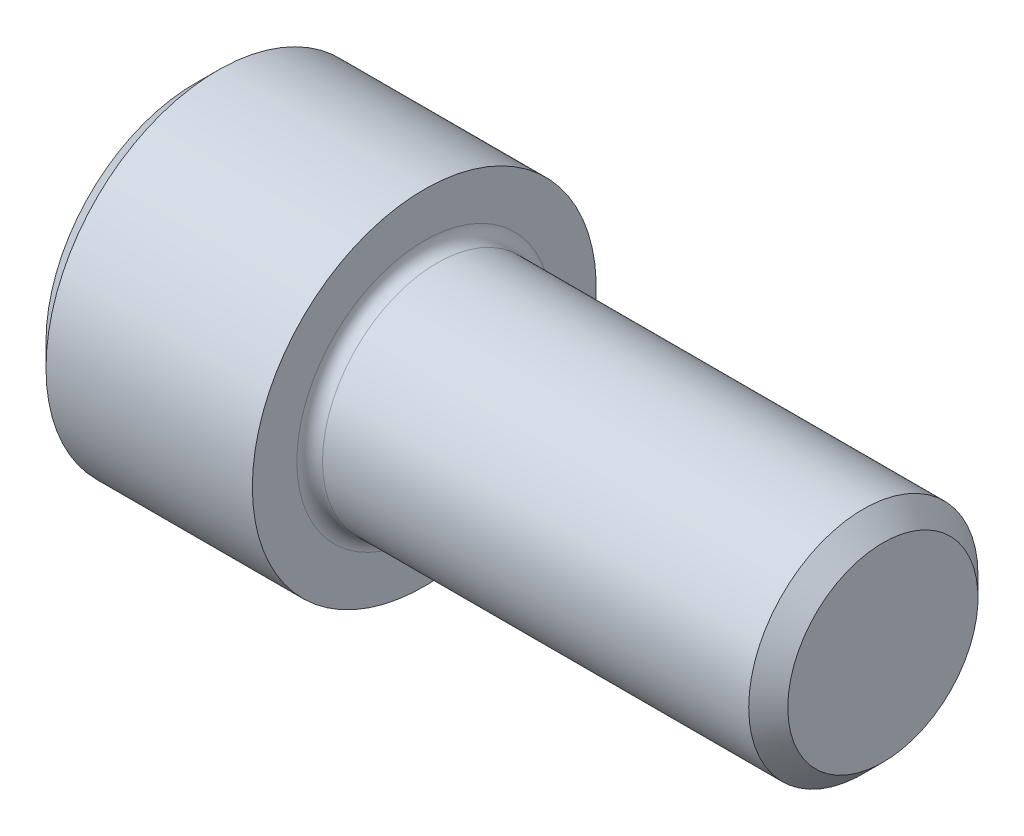
ISO-10303-21;
HEADER;
FILE_DESCRIPTION(('STEP AP214'),'2;1');
FILE_NAME('part.step','',(''),(''),'','','');
FILE_SCHEMA(('AUTOMOTIVE_DESIGN { 1 0 10303 214 1 1 1 1 }'));
ENDSEC;
DATA;
#1=APPLICATION_CONTEXT('core data for automotive mechanical design processes');
#2=APPLICATION_PROTOCOL_DEFINITION('international standard','automotive_design',2000,#1);
#3=PRODUCT_CONTEXT('',#1,'mechanical');
#4=PRODUCT('Part','Part','',(#3));
#5=PRODUCT_RELATED_PRODUCT_CATEGORY('part','',(#4));
#6=PRODUCT_DEFINITION_FORMATION('','',#4);
#7=PRODUCT_DEFINITION_CONTEXT('part definition',#1,'design');
#8=PRODUCT_DEFINITION('design','',#6,#7);
#9=PRODUCT_DEFINITION_SHAPE('','',#8);
#10=(LENGTH_UNIT() NAMED_UNIT(*) SI_UNIT(.MILLI.,.METRE.));
#11=(NAMED_UNIT(*) PLANE_ANGLE_UNIT() SI_UNIT($,.RADIAN.));
#12=(NAMED_UNIT(*) SI_UNIT($,.STERADIAN.) SOLID_ANGLE_UNIT());
#13=UNCERTAINTY_MEASURE_WITH_UNIT(LENGTH_MEASURE(1.E-05),#10,'distance_accuracy_value','');
#14=(GEOMETRIC_REPRESENTATION_CONTEXT(3) GLOBAL_UNCERTAINTY_ASSIGNED_CONTEXT((#13)) GLOBAL_UNIT_ASSIGNED_CONTEXT((#10,
#11,#12)) REPRESENTATION_CONTEXT('',''));
#15=CARTESIAN_POINT('',(0.,0.,0.));
#16=DIRECTION('',(0.,0.,1.));
#17=DIRECTION('',(1.,0.,0.));
#18=AXIS2_PLACEMENT_3D('',#15,#16,#17);
#19=CARTESIAN_POINT('',(-63.4945596151415,1.19648436429998,1.97705780897195));
#20=DIRECTION('',(-1.,0.,0.));
#21=DIRECTION('',(0.,0.,1.));
#22=AXIS2_PLACEMENT_3D('',#19,#20,#21);
#23=PLANE('',#22);
#24=DIRECTION('',(0.,-0.499999999999998,0.86602540378444));
#25=VECTOR('',#24,1.);
#26=CARTESIAN_POINT('',(-63.4945596151415,3.94611502131557,1.97705780897194));
#27=LINE('',#26,#25);
#28=CARTESIAN_POINT('',(-63.4945596151415,3.94611502131557,1.97705780897194));
#29=VERTEX_POINT('',#28);
#30=CARTESIAN_POINT('',(-63.4945596151415,2.57129969280778,4.35830780897194));
#31=VERTEX_POINT('',#30);
#32=EDGE_CURVE('E362',#29,#31,#27,.T.);
#33=ORIENTED_EDGE('',*,*,#32,.T.);
#34=DIRECTION('',(0.,1.,0.));
#35=VECTOR('',#34,1.);
#36=CARTESIAN_POINT('',(-63.4945596151415,-0.178330964207809,4.35830780897195));
#37=LINE('',#36,#35);
#38=CARTESIAN_POINT('',(-63.4945596151415,-0.178330964207809,4.35830780897195));
#39=VERTEX_POINT('',#38);
#40=EDGE_CURVE('E112',#39,#31,#37,.T.);
#41=ORIENTED_EDGE('',*,*,#40,.F.);
#42=DIRECTION('',(0.,-0.500000000000001,-0.866025403784438));
#43=VECTOR('',#42,1.);
#44=CARTESIAN_POINT('',(-63.4945596151415,-0.178330964207809,4.35830780897195));
#45=LINE('',#44,#43);
#46=CARTESIAN_POINT('',(-63.4945596151415,-1.55314629271561,1.97705780897195));
#47=VERTEX_POINT('',#46);
#48=EDGE_CURVE('E365',#39,#47,#45,.T.);
#49=ORIENTED_EDGE('',*,*,#48,.T.);
#50=DIRECTION('',(0.,0.499999999999998,-0.86602540378444));
#51=VECTOR('',#50,1.);
#52=CARTESIAN_POINT('',(-63.4945596151415,-1.55314629271561,1.97705780897195));
#53=LINE('',#52,#51);
#54=CARTESIAN_POINT('',(-63.4945596151415,-0.178330964207817,-0.404192191028052));
#55=VERTEX_POINT('',#54);
#56=EDGE_CURVE('E368',#47,#55,#53,.T.);
#57=ORIENTED_EDGE('',*,*,#56,.T.);
#58=DIRECTION('',(0.,-1.,0.));
#59=VECTOR('',#58,1.);
#60=CARTESIAN_POINT('',(-63.4945596151415,2.57129969280777,-0.404192191028056));
#61=LINE('',#60,#59);
#62=CARTESIAN_POINT('',(-63.4945596151415,2.57129969280777,-0.404192191028056));
#63=VERTEX_POINT('',#62);
#64=EDGE_CURVE('E371',#63,#55,#61,.T.);
#65=ORIENTED_EDGE('',*,*,#64,.F.);
#66=DIRECTION('',(0.,-0.500000000000001,-0.866025403784438));
#67=VECTOR('',#66,1.);
#68=CARTESIAN_POINT('',(-63.4945596151415,3.94611502131557,1.97705780897194));
#69=LINE('',#68,#67);
#70=EDGE_CURVE('E107',#29,#63,#69,.T.);
#71=ORIENTED_EDGE('',*,*,#70,.F.);
#72=EDGE_LOOP('',(#33,#41,#49,#57,#65,#71));
#73=FACE_BOUND('',#72,.T.);
#74=CARTESIAN_POINT('',(-63.4945596151415,1.19648436429998,1.97705780897195));
#75=DIRECTION('',(-1.,0.,0.));
#76=DIRECTION('',(0.,0.,1.));
#77=AXIS2_PLACEMENT_3D('',#74,#75,#76);
#78=CIRCLE('',#77,4.1275);
#79=CARTESIAN_POINT('',(-63.4945596151415,1.19648436429998,6.10455780897195));
#80=VERTEX_POINT('',#79);
#81=EDGE_CURVE('E123',#80,#80,#78,.T.);
#82=ORIENTED_EDGE('',*,*,#81,.T.);
#83=EDGE_LOOP('',(#82));
#84=FACE_BOUND('',#83,.T.);
#85=ADVANCED_FACE('F16',(#73,#84),#23,.T.);
#86=CARTESIAN_POINT('',(-44.4445596151415,3.83046436429998,1.97705780897195));
#87=DIRECTION('',(1.,0.,0.));
#88=DIRECTION('',(0.,0.,-1.));
#89=AXIS2_PLACEMENT_3D('',#86,#87,#88);
#90=PLANE('',#89);
#91=CARTESIAN_POINT('',(-44.4445596151415,1.19648436429998,1.97705780897195));
#92=DIRECTION('',(-1.,0.,0.));
#93=DIRECTION('',(0.,0.,1.));
#94=AXIS2_PLACEMENT_3D('',#91,#92,#93);
#95=CIRCLE('',#94,2.63398);
#96=CARTESIAN_POINT('',(-44.4445596151415,1.19648436429998,4.61103780897195));
#97=VERTEX_POINT('',#96);
#98=EDGE_CURVE('E136',#97,#97,#95,.T.);
#99=ORIENTED_EDGE('',*,*,#98,.F.);
#100=EDGE_LOOP('',(#99));
#101=FACE_BOUND('',#100,.T.);
#102=ADVANCED_FACE('F158',(#101),#90,.T.);
#103=CARTESIAN_POINT('',(-44.4445596151415,1.19648436429998,1.97705780897195));
#104=DIRECTION('',(-1.,0.,0.));
#105=DIRECTION('',(0.,0.,1.));
#106=AXIS2_PLACEMENT_3D('',#103,#104,#105);
#107=CONICAL_SURFACE('',#106,2.63398,0.785398163397382);
#108=CARTESIAN_POINT('',(-44.9855796151416,1.19648436429998,1.97705780897195));
#109=DIRECTION('',(-1.,0.,0.));
#110=DIRECTION('',(0.,0.,1.));
#111=AXIS2_PLACEMENT_3D('',#108,#109,#110);
#112=CIRCLE('',#111,3.17499999999995);
#113=CARTESIAN_POINT('',(-44.9855796151416,1.19648436429998,5.1520578089719));
#114=VERTEX_POINT('',#113);
#115=EDGE_CURVE('E133',#114,#114,#112,.T.);
#116=ORIENTED_EDGE('',*,*,#115,.F.);
#117=EDGE_LOOP('',(#116));
#118=FACE_BOUND('',#117,.T.);
#119=ORIENTED_EDGE('',*,*,#98,.T.);
#120=EDGE_LOOP('',(#119));
#121=FACE_BOUND('',#120,.T.);
#122=ADVANCED_FACE('F164',(#118,#121),#107,.T.);
#123=CARTESIAN_POINT('',(-95.2445596151415,1.19648436429998,1.97705780897195));
#124=DIRECTION('',(-1.,0.,0.));
#125=DIRECTION('',(0.,0.,1.));
#126=AXIS2_PLACEMENT_3D('',#123,#124,#125);
#127=CYLINDRICAL_SURFACE('',#126,3.17499999999998);
#128=CARTESIAN_POINT('',(-56.7889596151415,1.19648436429998,1.97705780897195));
#129=DIRECTION('',(1.,0.,0.));
#130=DIRECTION('',(0.,0.,-1.));
#131=AXIS2_PLACEMENT_3D('',#128,#129,#130);
#132=CIRCLE('',#131,3.17499999999998);
#133=CARTESIAN_POINT('',(-56.7889596151415,1.19648436429998,-1.19794219102803));
#134=VERTEX_POINT('',#133);
#135=EDGE_CURVE('E11',#134,#134,#132,.T.);
#136=ORIENTED_EDGE('',*,*,#135,.T.);
#137=EDGE_LOOP('',(#136));
#138=FACE_BOUND('',#137,.T.);
#139=ORIENTED_EDGE('',*,*,#115,.T.);
#140=EDGE_LOOP('',(#139));
#141=FACE_BOUND('',#140,.T.);
#142=ADVANCED_FACE('F175',(#138,#141),#127,.T.);
#143=CARTESIAN_POINT('',(-57.1445596151415,5.95898436429998,1.97705780897195));
#144=DIRECTION('',(1.,0.,0.));
#145=DIRECTION('',(0.,0.,-1.));
#146=AXIS2_PLACEMENT_3D('',#143,#144,#145);
#147=PLANE('',#146);
#148=CARTESIAN_POINT('',(-57.1445596151415,1.19648436429998,1.97705780897195));
#149=DIRECTION('',(1.,0.,0.));
#150=DIRECTION('',(0.,0.,-1.));
#151=AXIS2_PLACEMENT_3D('',#148,#149,#150);
#152=CIRCLE('',#151,3.53059999999998);
#153=CARTESIAN_POINT('',(-57.1445596151415,1.19648436429998,-1.55354219102803));
#154=VERTEX_POINT('',#153);
#155=EDGE_CURVE('E24',#154,#154,#152,.F.);
#156=ORIENTED_EDGE('',*,*,#155,.T.);
#157=EDGE_LOOP('',(#156));
#158=FACE_BOUND('',#157,.T.);
#159=CARTESIAN_POINT('',(-57.1445596151415,1.19648436429998,1.97705780897195));
#160=DIRECTION('',(-1.,0.,0.));
#161=DIRECTION('',(0.,0.,1.));
#162=AXIS2_PLACEMENT_3D('',#159,#160,#161);
#163=CIRCLE('',#162,4.7625);
#164=CARTESIAN_POINT('',(-57.1445596151415,1.19648436429998,6.73955780897195));
#165=VERTEX_POINT('',#164);
#166=EDGE_CURVE('E130',#165,#165,#163,.T.);
#167=ORIENTED_EDGE('',*,*,#166,.F.);
#168=EDGE_LOOP('',(#167));
#169=FACE_BOUND('',#168,.T.);
#170=ADVANCED_FACE('F141',(#158,#169),#147,.T.);
#171=CARTESIAN_POINT('',(-95.2445596151415,1.19648436429998,1.97705780897195));
#172=DIRECTION('',(-1.,0.,0.));
#173=DIRECTION('',(0.,0.,1.));
#174=AXIS2_PLACEMENT_3D('',#171,#172,#173);
#175=CYLINDRICAL_SURFACE('',#174,4.7625);
#176=ORIENTED_EDGE('',*,*,#166,.T.);
#177=EDGE_LOOP('',(#176));
#178=FACE_BOUND('',#177,.T.);
#179=CARTESIAN_POINT('',(-62.8595596151415,1.19648436429998,1.97705780897195));
#180=DIRECTION('',(-1.,0.,0.));
#181=DIRECTION('',(0.,0.,1.));
#182=AXIS2_PLACEMENT_3D('',#179,#180,#181);
#183=CIRCLE('',#182,4.7625);
#184=CARTESIAN_POINT('',(-62.8595596151415,1.19648436429998,6.73955780897195));
#185=VERTEX_POINT('',#184);
#186=EDGE_CURVE('E127',#185,#185,#183,.T.);
#187=ORIENTED_EDGE('',*,*,#186,.F.);
#188=EDGE_LOOP('',(#187));
#189=FACE_BOUND('',#188,.T.);
#190=ADVANCED_FACE('F153',(#178,#189),#175,.T.);
#191=CARTESIAN_POINT('',(-63.4945596151415,1.19648436429998,1.97705780897195));
#192=DIRECTION('',(1.,0.,0.));
#193=DIRECTION('',(0.,0.,-1.));
#194=AXIS2_PLACEMENT_3D('',#191,#192,#193);
#195=CONICAL_SURFACE('',#194,4.1275,0.785398163397448);
#196=ORIENTED_EDGE('',*,*,#186,.T.);
#197=EDGE_LOOP('',(#196));
#198=FACE_BOUND('',#197,.T.);
#199=ORIENTED_EDGE('',*,*,#81,.F.);
#200=EDGE_LOOP('',(#199));
#201=FACE_BOUND('',#200,.T.);
#202=ADVANCED_FACE('F145',(#198,#201),#195,.T.);
#203=CARTESIAN_POINT('',(-56.7889596151415,1.19648436429998,1.97705780897195));
#204=DIRECTION('',(1.,0.,0.));
#205=DIRECTION('',(0.,0.,-1.));
#206=AXIS2_PLACEMENT_3D('',#203,#204,#205);
#207=TOROIDAL_SURFACE('',#206,3.53059999999998,0.3556);
#208=ORIENTED_EDGE('',*,*,#135,.F.);
#209=EDGE_LOOP('',(#208));
#210=FACE_BOUND('',#209,.T.);
#211=ORIENTED_EDGE('',*,*,#155,.F.);
#212=EDGE_LOOP('',(#211));
#213=FACE_BOUND('',#212,.T.);
#214=ADVANCED_FACE('F18',(#210,#213),#207,.F.);
#215=CARTESIAN_POINT('',(-60.4465596151415,3.94611502131557,1.97705780897194));
#216=DIRECTION('',(0.,-0.86602540378444,-0.499999999999998));
#217=DIRECTION('',(0.,0.499999999999998,-0.86602540378444));
#218=AXIS2_PLACEMENT_3D('',#215,#216,#217);
#219=PLANE('',#218);
#220=ORIENTED_EDGE('',*,*,#32,.F.);
#221=DIRECTION('',(-1.,0.,0.));
#222=VECTOR('',#221,1.);
#223=CARTESIAN_POINT('',(-60.4465596151415,3.94611502131557,1.97705780897194));
#224=LINE('',#223,#222);
#225=CARTESIAN_POINT('',(-60.4465596151415,3.94611502131557,1.97705780897194));
#226=VERTEX_POINT('',#225);
#227=EDGE_CURVE('E361',#226,#29,#224,.T.);
#228=ORIENTED_EDGE('',*,*,#227,.F.);
#229=DIRECTION('',(0.,-0.499999999999998,0.86602540378444));
#230=VECTOR('',#229,1.);
#231=CARTESIAN_POINT('',(-60.4465596151415,3.94611502131557,1.97705780897194));
#232=LINE('',#231,#230);
#233=CARTESIAN_POINT('',(-60.4465596151415,3.25870735706168,3.16768280897195));
#234=VERTEX_POINT('',#233);
#235=EDGE_CURVE('E99',#226,#234,#232,.T.);
#236=ORIENTED_EDGE('',*,*,#235,.T.);
#237=CARTESIAN_POINT('',(-60.4465596151415,2.57129969280778,4.35830780897194));
#238=VERTEX_POINT('',#237);
#239=EDGE_CURVE('E90',#234,#238,#232,.T.);
#240=ORIENTED_EDGE('',*,*,#239,.T.);
#241=DIRECTION('',(-1.,0.,0.));
#242=VECTOR('',#241,1.);
#243=CARTESIAN_POINT('',(-60.4465596151415,2.57129969280778,4.35830780897194));
#244=LINE('',#243,#242);
#245=EDGE_CURVE('E104',#238,#31,#244,.T.);
#246=ORIENTED_EDGE('',*,*,#245,.T.);
#247=EDGE_LOOP('',(#220,#228,#236,#240,#246));
#248=FACE_BOUND('',#247,.T.);
#249=ADVANCED_FACE('F103',(#248),#219,.T.);
#250=CARTESIAN_POINT('',(-60.4465596151415,-0.178330964207809,4.35830780897195));
#251=DIRECTION('',(0.,0.,1.));
#252=DIRECTION('',(0.,-1.,0.));
#253=AXIS2_PLACEMENT_3D('',#250,#251,#252);
#254=PLANE('',#253);
#255=ORIENTED_EDGE('',*,*,#40,.T.);
#256=ORIENTED_EDGE('',*,*,#245,.F.);
#257=DIRECTION('',(0.,1.,0.));
#258=VECTOR('',#257,1.);
#259=CARTESIAN_POINT('',(-60.4465596151415,-0.178330964207809,4.35830780897195));
#260=LINE('',#259,#258);
#261=CARTESIAN_POINT('',(-60.4465596151415,1.19648436429998,4.35830780897195));
#262=VERTEX_POINT('',#261);
#263=EDGE_CURVE('E87',#262,#238,#260,.T.);
#264=ORIENTED_EDGE('',*,*,#263,.F.);
#265=CARTESIAN_POINT('',(-60.4465596151415,-0.178330964207809,4.35830780897195));
#266=VERTEX_POINT('',#265);
#267=EDGE_CURVE('E98',#266,#262,#260,.T.);
#268=ORIENTED_EDGE('',*,*,#267,.F.);
#269=DIRECTION('',(-1.,0.,0.));
#270=VECTOR('',#269,1.);
#271=CARTESIAN_POINT('',(-60.4465596151415,-0.178330964207809,4.35830780897195));
#272=LINE('',#271,#270);
#273=EDGE_CURVE('E114',#266,#39,#272,.T.);
#274=ORIENTED_EDGE('',*,*,#273,.T.);
#275=EDGE_LOOP('',(#255,#256,#264,#268,#274));
#276=FACE_BOUND('',#275,.T.);
#277=ADVANCED_FACE('F109',(#276),#254,.F.);
#278=CARTESIAN_POINT('',(-60.4465596151415,-0.178330964207809,4.35830780897195));
#279=DIRECTION('',(0.,0.866025403784438,-0.500000000000001));
#280=DIRECTION('',(0.,0.500000000000001,0.866025403784438));
#281=AXIS2_PLACEMENT_3D('',#278,#279,#280);
#282=PLANE('',#281);
#283=ORIENTED_EDGE('',*,*,#48,.F.);
#284=ORIENTED_EDGE('',*,*,#273,.F.);
#285=DIRECTION('',(0.,-0.500000000000001,-0.866025403784438));
#286=VECTOR('',#285,1.);
#287=CARTESIAN_POINT('',(-60.4465596151415,-0.178330964207809,4.35830780897195));
#288=LINE('',#287,#286);
#289=CARTESIAN_POINT('',(-60.4465596151415,-0.86573862846171,3.16768280897195));
#290=VERTEX_POINT('',#289);
#291=EDGE_CURVE('E342',#266,#290,#288,.T.);
#292=ORIENTED_EDGE('',*,*,#291,.T.);
#293=CARTESIAN_POINT('',(-60.4465596151415,-1.55314629271561,1.97705780897195));
#294=VERTEX_POINT('',#293);
#295=EDGE_CURVE('E344',#290,#294,#288,.T.);
#296=ORIENTED_EDGE('',*,*,#295,.T.);
#297=DIRECTION('',(-1.,0.,0.));
#298=VECTOR('',#297,1.);
#299=CARTESIAN_POINT('',(-60.4465596151415,-1.55314629271561,1.97705780897195));
#300=LINE('',#299,#298);
#301=EDGE_CURVE('E119',#294,#47,#300,.T.);
#302=ORIENTED_EDGE('',*,*,#301,.T.);
#303=EDGE_LOOP('',(#283,#284,#292,#296,#302));
#304=FACE_BOUND('',#303,.T.);
#305=ADVANCED_FACE('F230',(#304),#282,.T.);
#306=CARTESIAN_POINT('',(-60.4465596151415,-1.55314629271561,1.97705780897195));
#307=DIRECTION('',(0.,0.86602540378444,0.499999999999998));
#308=DIRECTION('',(0.,-0.499999999999998,0.86602540378444));
#309=AXIS2_PLACEMENT_3D('',#306,#307,#308);
#310=PLANE('',#309);
#311=ORIENTED_EDGE('',*,*,#56,.F.);
#312=ORIENTED_EDGE('',*,*,#301,.F.);
#313=DIRECTION('',(0.,0.499999999999998,-0.86602540378444));
#314=VECTOR('',#313,1.);
#315=CARTESIAN_POINT('',(-60.4465596151415,-1.55314629271561,1.97705780897195));
#316=LINE('',#315,#314);
#317=CARTESIAN_POINT('',(-60.4465596151415,-0.865738628461716,0.786432808971956));
#318=VERTEX_POINT('',#317);
#319=EDGE_CURVE('E347',#294,#318,#316,.T.);
#320=ORIENTED_EDGE('',*,*,#319,.T.);
#321=CARTESIAN_POINT('',(-60.4465596151415,-0.178330964207817,-0.404192191028052));
#322=VERTEX_POINT('',#321);
#323=EDGE_CURVE('E351',#318,#322,#316,.T.);
#324=ORIENTED_EDGE('',*,*,#323,.T.);
#325=DIRECTION('',(-1.,0.,0.));
#326=VECTOR('',#325,1.);
#327=CARTESIAN_POINT('',(-60.4465596151415,-0.178330964207817,-0.404192191028052));
#328=LINE('',#327,#326);
#329=EDGE_CURVE('E380',#322,#55,#328,.T.);
#330=ORIENTED_EDGE('',*,*,#329,.T.);
#331=EDGE_LOOP('',(#311,#312,#320,#324,#330));
#332=FACE_BOUND('',#331,.T.);
#333=ADVANCED_FACE('F239',(#332),#310,.T.);
#334=CARTESIAN_POINT('',(-60.4465596151415,2.57129969280777,-0.404192191028056));
#335=DIRECTION('',(0.,0.,-1.));
#336=DIRECTION('',(0.,1.,0.));
#337=AXIS2_PLACEMENT_3D('',#334,#335,#336);
#338=PLANE('',#337);
#339=ORIENTED_EDGE('',*,*,#64,.T.);
#340=ORIENTED_EDGE('',*,*,#329,.F.);
#341=DIRECTION('',(0.,-1.,0.));
#342=VECTOR('',#341,1.);
#343=CARTESIAN_POINT('',(-60.4465596151415,2.57129969280777,-0.404192191028056));
#344=LINE('',#343,#342);
#345=CARTESIAN_POINT('',(-60.4465596151415,1.19648436429997,-0.40419219102805));
#346=VERTEX_POINT('',#345);
#347=EDGE_CURVE('E355',#346,#322,#344,.T.);
#348=ORIENTED_EDGE('',*,*,#347,.F.);
#349=CARTESIAN_POINT('',(-60.4465596151415,2.57129969280777,-0.404192191028056));
#350=VERTEX_POINT('',#349);
#351=EDGE_CURVE('E31',#350,#346,#344,.T.);
#352=ORIENTED_EDGE('',*,*,#351,.F.);
#353=DIRECTION('',(-1.,0.,0.));
#354=VECTOR('',#353,1.);
#355=CARTESIAN_POINT('',(-60.4465596151415,2.57129969280777,-0.404192191028056));
#356=LINE('',#355,#354);
#357=EDGE_CURVE('E377',#350,#63,#356,.T.);
#358=ORIENTED_EDGE('',*,*,#357,.T.);
#359=EDGE_LOOP('',(#339,#340,#348,#352,#358));
#360=FACE_BOUND('',#359,.T.);
#361=ADVANCED_FACE('F249',(#360),#338,.F.);
#362=CARTESIAN_POINT('',(-60.4465596151415,3.94611502131557,1.97705780897194));
#363=DIRECTION('',(0.,0.866025403784438,-0.500000000000001));
#364=DIRECTION('',(0.,0.500000000000001,0.866025403784438));
#365=AXIS2_PLACEMENT_3D('',#362,#363,#364);
#366=PLANE('',#365);
#367=ORIENTED_EDGE('',*,*,#70,.T.);
#368=ORIENTED_EDGE('',*,*,#357,.F.);
#369=DIRECTION('',(0.,-0.500000000000001,-0.866025403784438));
#370=VECTOR('',#369,1.);
#371=CARTESIAN_POINT('',(-60.4465596151415,3.94611502131557,1.97705780897194));
#372=LINE('',#371,#370);
#373=CARTESIAN_POINT('',(-60.4465596151415,3.25870735706168,0.786432808971943));
#374=VERTEX_POINT('',#373);
#375=EDGE_CURVE('E357',#374,#350,#372,.T.);
#376=ORIENTED_EDGE('',*,*,#375,.F.);
#377=EDGE_CURVE('E358',#226,#374,#372,.T.);
#378=ORIENTED_EDGE('',*,*,#377,.F.);
#379=ORIENTED_EDGE('',*,*,#227,.T.);
#380=EDGE_LOOP('',(#367,#368,#376,#378,#379));
#381=FACE_BOUND('',#380,.T.);
#382=ADVANCED_FACE('F259',(#381),#366,.F.);
#383=CARTESIAN_POINT('',(-60.4465596151415,5.32093034982337,-0.40419219102806));
#384=DIRECTION('',(1.,0.,0.));
#385=DIRECTION('',(0.,0.,-1.));
#386=AXIS2_PLACEMENT_3D('',#383,#384,#385);
#387=PLANE('',#386);
#388=ORIENTED_EDGE('',*,*,#347,.T.);
#389=ORIENTED_EDGE('',*,*,#323,.F.);
#390=CARTESIAN_POINT('',(-60.4465596151415,1.19648436429998,1.97705780897195));
#391=DIRECTION('',(-1.,0.,0.));
#392=DIRECTION('',(0.,0.,1.));
#393=AXIS2_PLACEMENT_3D('',#390,#391,#392);
#394=CIRCLE('',#393,2.38125);
#395=EDGE_CURVE('E387',#346,#318,#394,.T.);
#396=ORIENTED_EDGE('',*,*,#395,.F.);
#397=EDGE_LOOP('',(#388,#389,#396));
#398=FACE_BOUND('',#397,.T.);
#399=ADVANCED_FACE('F269',(#398),#387,.F.);
#400=ORIENTED_EDGE('',*,*,#319,.F.);
#401=ORIENTED_EDGE('',*,*,#295,.F.);
#402=EDGE_CURVE('E117',#318,#290,#394,.T.);
#403=ORIENTED_EDGE('',*,*,#402,.F.);
#404=EDGE_LOOP('',(#400,#401,#403));
#405=FACE_BOUND('',#404,.T.);
#406=ADVANCED_FACE('F279',(#405),#387,.F.);
#407=ORIENTED_EDGE('',*,*,#291,.F.);
#408=ORIENTED_EDGE('',*,*,#267,.T.);
#409=EDGE_CURVE('E113',#290,#262,#394,.T.);
#410=ORIENTED_EDGE('',*,*,#409,.F.);
#411=EDGE_LOOP('',(#407,#408,#410));
#412=FACE_BOUND('',#411,.T.);
#413=ADVANCED_FACE('F290',(#412),#387,.F.);
#414=ORIENTED_EDGE('',*,*,#263,.T.);
#415=ORIENTED_EDGE('',*,*,#239,.F.);
#416=EDGE_CURVE('E93',#262,#234,#394,.T.);
#417=ORIENTED_EDGE('',*,*,#416,.F.);
#418=EDGE_LOOP('',(#414,#415,#417));
#419=FACE_BOUND('',#418,.T.);
#420=ADVANCED_FACE('F89',(#419),#387,.F.);
#421=ORIENTED_EDGE('',*,*,#235,.F.);
#422=ORIENTED_EDGE('',*,*,#377,.T.);
#423=EDGE_CURVE('E124',#234,#374,#394,.T.);
#424=ORIENTED_EDGE('',*,*,#423,.F.);
#425=EDGE_LOOP('',(#421,#422,#424));
#426=FACE_BOUND('',#425,.T.);
#427=ADVANCED_FACE('F307',(#426),#387,.F.);
#428=ORIENTED_EDGE('',*,*,#375,.T.);
#429=ORIENTED_EDGE('',*,*,#351,.T.);
#430=EDGE_CURVE('E386',#374,#346,#394,.T.);
#431=ORIENTED_EDGE('',*,*,#430,.F.);
#432=EDGE_LOOP('',(#428,#429,#431));
#433=FACE_BOUND('',#432,.T.);
#434=ADVANCED_FACE('F282',(#433),#387,.F.);
#435=CARTESIAN_POINT('',(-60.4465596151415,1.19648436429998,1.97705780897195));
#436=DIRECTION('',(-1.,0.,0.));
#437=DIRECTION('',(0.,0.,1.));
#438=AXIS2_PLACEMENT_3D('',#435,#436,#437);
#439=CONICAL_SURFACE('',#438,2.38125,1.04719755119659);
#440=CARTESIAN_POINT('',(-59.0717442866337,1.19648436429998,1.97705780897195));
#441=VERTEX_POINT('',#440);
#442=VERTEX_LOOP('',#441);
#443=FACE_BOUND('',#442,.T.);
#444=ORIENTED_EDGE('',*,*,#416,.T.);
#445=ORIENTED_EDGE('',*,*,#423,.T.);
#446=ORIENTED_EDGE('',*,*,#430,.T.);
#447=ORIENTED_EDGE('',*,*,#395,.T.);
#448=ORIENTED_EDGE('',*,*,#402,.T.);
#449=ORIENTED_EDGE('',*,*,#409,.T.);
#450=EDGE_LOOP('',(#444,#445,#446,#447,#448,#449));
#451=FACE_BOUND('',#450,.T.);
#452=ADVANCED_FACE('F168',(#443,#451),#439,.F.);
#453=CLOSED_SHELL('',(#85,#102,#122,#142,#170,#190,#202,#214,#249,#277,#305,#333,#361,#382,#399,
#406,#413,#420,#427,#434,#452));
#454=MANIFOLD_SOLID_BREP('B1',#453);
#455=ADVANCED_BREP_SHAPE_REPRESENTATION('',(#18,#454),#14);
#456=SHAPE_DEFINITION_REPRESENTATION(#9,#455);
ENDSEC;
END-ISO-10303-21;
